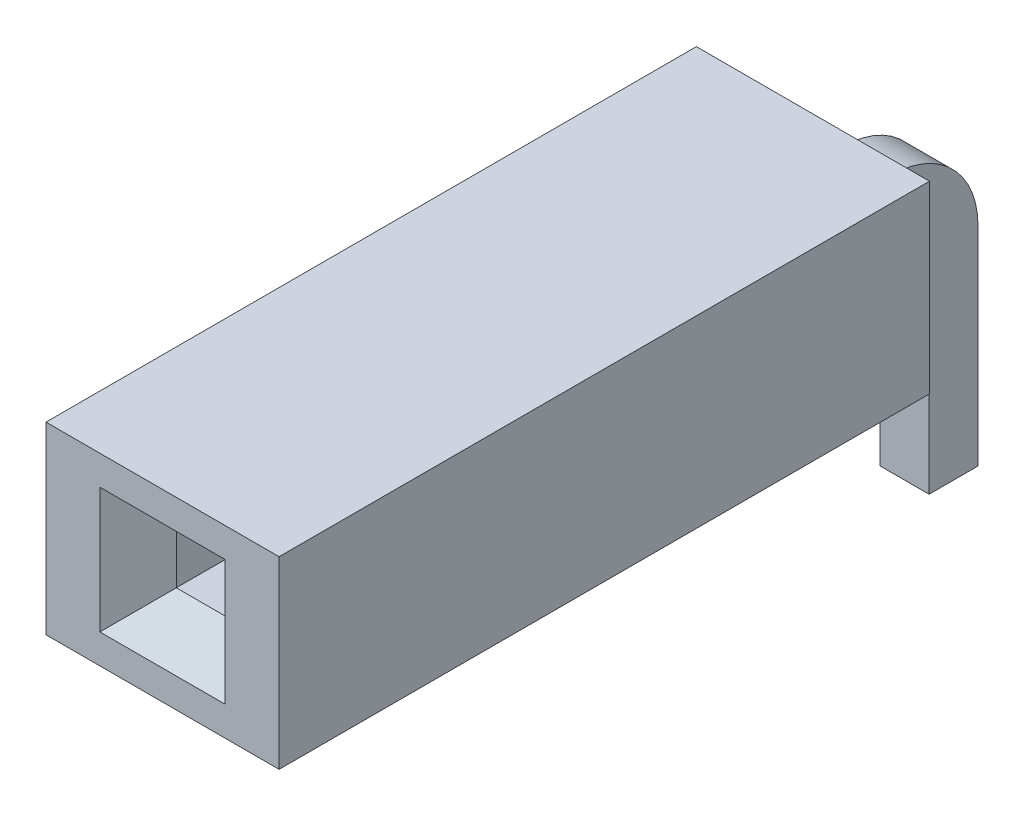
ISO-10303-21;
HEADER;
FILE_DESCRIPTION(('STEP AP214'),'2;1');
FILE_NAME('part.step','',(''),(''),'','','');
FILE_SCHEMA(('AUTOMOTIVE_DESIGN { 1 0 10303 214 1 1 1 1 }'));
ENDSEC;
DATA;
#1=APPLICATION_CONTEXT('core data for automotive mechanical design processes');
#2=APPLICATION_PROTOCOL_DEFINITION('international standard','automotive_design',2000,#1);
#3=PRODUCT_CONTEXT('',#1,'mechanical');
#4=PRODUCT('Part','Part','',(#3));
#5=PRODUCT_RELATED_PRODUCT_CATEGORY('part','',(#4));
#6=PRODUCT_DEFINITION_FORMATION('','',#4);
#7=PRODUCT_DEFINITION_CONTEXT('part definition',#1,'design');
#8=PRODUCT_DEFINITION('design','',#6,#7);
#9=PRODUCT_DEFINITION_SHAPE('','',#8);
#10=(LENGTH_UNIT() NAMED_UNIT(*) SI_UNIT(.MILLI.,.METRE.));
#11=(NAMED_UNIT(*) PLANE_ANGLE_UNIT() SI_UNIT($,.RADIAN.));
#12=(NAMED_UNIT(*) SI_UNIT($,.STERADIAN.) SOLID_ANGLE_UNIT());
#13=UNCERTAINTY_MEASURE_WITH_UNIT(LENGTH_MEASURE(1.E-05),#10,'distance_accuracy_value','');
#14=(GEOMETRIC_REPRESENTATION_CONTEXT(3) GLOBAL_UNCERTAINTY_ASSIGNED_CONTEXT((#13)) GLOBAL_UNIT_ASSIGNED_CONTEXT((#10,
#11,#12)) REPRESENTATION_CONTEXT('',''));
#15=CARTESIAN_POINT('',(0.,0.,0.));
#16=DIRECTION('',(0.,0.,1.));
#17=DIRECTION('',(1.,0.,0.));
#18=AXIS2_PLACEMENT_3D('',#15,#16,#17);
#19=CARTESIAN_POINT('',(0.,0.,0.));
#20=DIRECTION('',(0.,0.,1.));
#21=DIRECTION('',(1.,0.,0.));
#22=AXIS2_PLACEMENT_3D('',#19,#20,#21);
#23=PLANE('',#22);
#24=DIRECTION('',(0.,-1.,0.));
#25=VECTOR('',#24,1.);
#26=CARTESIAN_POINT('',(-1.525,1.205,0.));
#27=LINE('',#26,#25);
#28=CARTESIAN_POINT('',(-1.525,1.205,0.));
#29=VERTEX_POINT('',#28);
#30=CARTESIAN_POINT('',(-1.525,-1.205,0.));
#31=VERTEX_POINT('',#30);
#32=EDGE_CURVE('E269',#29,#31,#27,.T.);
#33=ORIENTED_EDGE('',*,*,#32,.F.);
#34=DIRECTION('',(1.,0.,0.));
#35=VECTOR('',#34,1.);
#36=CARTESIAN_POINT('',(-1.525,1.205,0.));
#37=LINE('',#36,#35);
#38=CARTESIAN_POINT('',(1.525,1.205,0.));
#39=VERTEX_POINT('',#38);
#40=EDGE_CURVE('E275',#29,#39,#37,.T.);
#41=ORIENTED_EDGE('',*,*,#40,.T.);
#42=DIRECTION('',(0.,-1.,0.));
#43=VECTOR('',#42,1.);
#44=CARTESIAN_POINT('',(1.525,1.205,0.));
#45=LINE('',#44,#43);
#46=CARTESIAN_POINT('',(1.525,-1.205,0.));
#47=VERTEX_POINT('',#46);
#48=EDGE_CURVE('E294',#39,#47,#45,.T.);
#49=ORIENTED_EDGE('',*,*,#48,.T.);
#50=DIRECTION('',(1.,0.,0.));
#51=VECTOR('',#50,1.);
#52=CARTESIAN_POINT('',(-1.525,-1.205,0.));
#53=LINE('',#52,#51);
#54=EDGE_CURVE('E290',#31,#47,#53,.T.);
#55=ORIENTED_EDGE('',*,*,#54,.F.);
#56=EDGE_LOOP('',(#33,#41,#49,#55));
#57=FACE_BOUND('',#56,.T.);
#58=DIRECTION('',(0.,1.,0.));
#59=VECTOR('',#58,1.);
#60=CARTESIAN_POINT('',(-0.32,-0.32,0.));
#61=LINE('',#60,#59);
#62=CARTESIAN_POINT('',(-0.32,-0.32,0.));
#63=VERTEX_POINT('',#62);
#64=CARTESIAN_POINT('',(-0.32,0.32,0.));
#65=VERTEX_POINT('',#64);
#66=EDGE_CURVE('E234',#63,#65,#61,.T.);
#67=ORIENTED_EDGE('',*,*,#66,.F.);
#68=DIRECTION('',(-1.,0.,0.));
#69=VECTOR('',#68,1.);
#70=CARTESIAN_POINT('',(0.32,-0.32,0.));
#71=LINE('',#70,#69);
#72=CARTESIAN_POINT('',(0.32,-0.32,0.));
#73=VERTEX_POINT('',#72);
#74=EDGE_CURVE('E201',#73,#63,#71,.T.);
#75=ORIENTED_EDGE('',*,*,#74,.F.);
#76=DIRECTION('',(0.,1.,0.));
#77=VECTOR('',#76,1.);
#78=CARTESIAN_POINT('',(0.32,-0.32,0.));
#79=LINE('',#78,#77);
#80=CARTESIAN_POINT('',(0.32,0.32,0.));
#81=VERTEX_POINT('',#80);
#82=EDGE_CURVE('E206',#73,#81,#79,.T.);
#83=ORIENTED_EDGE('',*,*,#82,.T.);
#84=DIRECTION('',(-1.,0.,0.));
#85=VECTOR('',#84,1.);
#86=CARTESIAN_POINT('',(0.32,0.32,0.));
#87=LINE('',#86,#85);
#88=EDGE_CURVE('E188',#81,#65,#87,.T.);
#89=ORIENTED_EDGE('',*,*,#88,.T.);
#90=EDGE_LOOP('',(#67,#75,#83,#89));
#91=FACE_BOUND('',#90,.T.);
#92=ADVANCED_FACE('F47',(#57,#91),#23,.F.);
#93=CARTESIAN_POINT('',(0.,0.,8.51));
#94=DIRECTION('',(0.,0.,1.));
#95=DIRECTION('',(1.,0.,0.));
#96=AXIS2_PLACEMENT_3D('',#93,#94,#95);
#97=PLANE('',#96);
#98=DIRECTION('',(1.,0.,0.));
#99=VECTOR('',#98,1.);
#100=CARTESIAN_POINT('',(0.32,0.82,8.51));
#101=LINE('',#100,#99);
#102=CARTESIAN_POINT('',(-0.82,0.82,8.51));
#103=VERTEX_POINT('',#102);
#104=CARTESIAN_POINT('',(0.819999999999999,0.82,8.51));
#105=VERTEX_POINT('',#104);
#106=EDGE_CURVE('E323',#103,#105,#101,.T.);
#107=ORIENTED_EDGE('',*,*,#106,.T.);
#108=DIRECTION('',(0.,-1.,0.));
#109=VECTOR('',#108,1.);
#110=CARTESIAN_POINT('',(0.82,-0.32,8.51));
#111=LINE('',#110,#109);
#112=CARTESIAN_POINT('',(0.82,-0.819999999999999,8.51));
#113=VERTEX_POINT('',#112);
#114=EDGE_CURVE('E326',#105,#113,#111,.T.);
#115=ORIENTED_EDGE('',*,*,#114,.T.);
#116=DIRECTION('',(-1.,0.,0.));
#117=VECTOR('',#116,1.);
#118=CARTESIAN_POINT('',(0.,-0.82,8.51));
#119=LINE('',#118,#117);
#120=CARTESIAN_POINT('',(-0.82,-0.82,8.51));
#121=VERTEX_POINT('',#120);
#122=EDGE_CURVE('E317',#113,#121,#119,.T.);
#123=ORIENTED_EDGE('',*,*,#122,.T.);
#124=DIRECTION('',(0.,1.,0.));
#125=VECTOR('',#124,1.);
#126=CARTESIAN_POINT('',(-0.82,0.,8.51));
#127=LINE('',#126,#125);
#128=EDGE_CURVE('E320',#121,#103,#127,.T.);
#129=ORIENTED_EDGE('',*,*,#128,.T.);
#130=EDGE_LOOP('',(#107,#115,#123,#129));
#131=FACE_BOUND('',#130,.T.);
#132=DIRECTION('',(0.,-1.,0.));
#133=VECTOR('',#132,1.);
#134=CARTESIAN_POINT('',(-1.525,1.205,8.51));
#135=LINE('',#134,#133);
#136=CARTESIAN_POINT('',(-1.525,1.205,8.51));
#137=VERTEX_POINT('',#136);
#138=CARTESIAN_POINT('',(-1.525,-1.205,8.51));
#139=VERTEX_POINT('',#138);
#140=EDGE_CURVE('E270',#137,#139,#135,.T.);
#141=ORIENTED_EDGE('',*,*,#140,.T.);
#142=DIRECTION('',(1.,0.,0.));
#143=VECTOR('',#142,1.);
#144=CARTESIAN_POINT('',(-1.525,-1.205,8.51));
#145=LINE('',#144,#143);
#146=CARTESIAN_POINT('',(1.525,-1.205,8.51));
#147=VERTEX_POINT('',#146);
#148=EDGE_CURVE('E274',#139,#147,#145,.T.);
#149=ORIENTED_EDGE('',*,*,#148,.T.);
#150=DIRECTION('',(0.,-1.,0.));
#151=VECTOR('',#150,1.);
#152=CARTESIAN_POINT('',(1.525,1.205,8.51));
#153=LINE('',#152,#151);
#154=CARTESIAN_POINT('',(1.525,1.205,8.51));
#155=VERTEX_POINT('',#154);
#156=EDGE_CURVE('E278',#155,#147,#153,.T.);
#157=ORIENTED_EDGE('',*,*,#156,.F.);
#158=DIRECTION('',(1.,0.,0.));
#159=VECTOR('',#158,1.);
#160=CARTESIAN_POINT('',(-1.525,1.205,8.51));
#161=LINE('',#160,#159);
#162=EDGE_CURVE('E282',#137,#155,#161,.T.);
#163=ORIENTED_EDGE('',*,*,#162,.F.);
#164=EDGE_LOOP('',(#141,#149,#157,#163));
#165=FACE_BOUND('',#164,.T.);
#166=ADVANCED_FACE('F441',(#131,#165),#97,.T.);
#167=CARTESIAN_POINT('',(-1.525,1.205,8.51));
#168=DIRECTION('',(1.,0.,0.));
#169=DIRECTION('',(0.,0.,-1.));
#170=AXIS2_PLACEMENT_3D('',#167,#168,#169);
#171=PLANE('',#170);
#172=ORIENTED_EDGE('',*,*,#32,.T.);
#173=DIRECTION('',(0.,0.,-1.));
#174=VECTOR('',#173,1.);
#175=CARTESIAN_POINT('',(-1.525,-1.205,8.51));
#176=LINE('',#175,#174);
#177=EDGE_CURVE('E309',#139,#31,#176,.T.);
#178=ORIENTED_EDGE('',*,*,#177,.F.);
#179=ORIENTED_EDGE('',*,*,#140,.F.);
#180=DIRECTION('',(0.,0.,-1.));
#181=VECTOR('',#180,1.);
#182=CARTESIAN_POINT('',(-1.525,1.205,8.51));
#183=LINE('',#182,#181);
#184=EDGE_CURVE('E286',#137,#29,#183,.T.);
#185=ORIENTED_EDGE('',*,*,#184,.T.);
#186=EDGE_LOOP('',(#172,#178,#179,#185));
#187=FACE_BOUND('',#186,.T.);
#188=ADVANCED_FACE('F446',(#187),#171,.F.);
#189=CARTESIAN_POINT('',(-1.525,-1.205,8.51));
#190=DIRECTION('',(0.,1.,0.));
#191=DIRECTION('',(0.,0.,1.));
#192=AXIS2_PLACEMENT_3D('',#189,#190,#191);
#193=PLANE('',#192);
#194=ORIENTED_EDGE('',*,*,#54,.T.);
#195=DIRECTION('',(0.,0.,-1.));
#196=VECTOR('',#195,1.);
#197=CARTESIAN_POINT('',(1.525,-1.205,8.51));
#198=LINE('',#197,#196);
#199=EDGE_CURVE('E306',#147,#47,#198,.T.);
#200=ORIENTED_EDGE('',*,*,#199,.F.);
#201=ORIENTED_EDGE('',*,*,#148,.F.);
#202=ORIENTED_EDGE('',*,*,#177,.T.);
#203=EDGE_LOOP('',(#194,#200,#201,#202));
#204=FACE_BOUND('',#203,.T.);
#205=ADVANCED_FACE('F460',(#204),#193,.F.);
#206=CARTESIAN_POINT('',(1.525,1.205,8.51));
#207=DIRECTION('',(1.,0.,0.));
#208=DIRECTION('',(0.,0.,-1.));
#209=AXIS2_PLACEMENT_3D('',#206,#207,#208);
#210=PLANE('',#209);
#211=ORIENTED_EDGE('',*,*,#48,.F.);
#212=DIRECTION('',(0.,0.,-1.));
#213=VECTOR('',#212,1.);
#214=CARTESIAN_POINT('',(1.525,1.205,8.51));
#215=LINE('',#214,#213);
#216=EDGE_CURVE('E303',#155,#39,#215,.T.);
#217=ORIENTED_EDGE('',*,*,#216,.F.);
#218=ORIENTED_EDGE('',*,*,#156,.T.);
#219=ORIENTED_EDGE('',*,*,#199,.T.);
#220=EDGE_LOOP('',(#211,#217,#218,#219));
#221=FACE_BOUND('',#220,.T.);
#222=ADVANCED_FACE('F456',(#221),#210,.T.);
#223=CARTESIAN_POINT('',(-1.525,1.205,8.51));
#224=DIRECTION('',(0.,1.,0.));
#225=DIRECTION('',(0.,0.,1.));
#226=AXIS2_PLACEMENT_3D('',#223,#224,#225);
#227=PLANE('',#226);
#228=ORIENTED_EDGE('',*,*,#40,.F.);
#229=ORIENTED_EDGE('',*,*,#184,.F.);
#230=ORIENTED_EDGE('',*,*,#162,.T.);
#231=ORIENTED_EDGE('',*,*,#216,.T.);
#232=EDGE_LOOP('',(#228,#229,#230,#231));
#233=FACE_BOUND('',#232,.T.);
#234=ADVANCED_FACE('F452',(#233),#227,.T.);
#235=CARTESIAN_POINT('',(-0.32,0.,3.51));
#236=DIRECTION('',(1.,0.,0.));
#237=DIRECTION('',(0.,0.,-1.));
#238=AXIS2_PLACEMENT_3D('',#235,#236,#237);
#239=PLANE('',#238);
#240=DIRECTION('',(0.,0.,1.));
#241=VECTOR('',#240,1.);
#242=CARTESIAN_POINT('',(-0.32,0.32,3.51));
#243=LINE('',#242,#241);
#244=CARTESIAN_POINT('',(-0.32,0.32,3.51));
#245=VERTEX_POINT('',#244);
#246=CARTESIAN_POINT('',(-0.32,0.32,8.01));
#247=VERTEX_POINT('',#246);
#248=EDGE_CURVE('E265',#245,#247,#243,.T.);
#249=ORIENTED_EDGE('',*,*,#248,.T.);
#250=DIRECTION('',(0.,-1.,0.));
#251=VECTOR('',#250,1.);
#252=CARTESIAN_POINT('',(-0.32,0.,8.01));
#253=LINE('',#252,#251);
#254=CARTESIAN_POINT('',(-0.32,-0.32,8.01));
#255=VERTEX_POINT('',#254);
#256=EDGE_CURVE('E333',#247,#255,#253,.T.);
#257=ORIENTED_EDGE('',*,*,#256,.T.);
#258=DIRECTION('',(0.,0.,1.));
#259=VECTOR('',#258,1.);
#260=CARTESIAN_POINT('',(-0.32,-0.32,3.51));
#261=LINE('',#260,#259);
#262=CARTESIAN_POINT('',(-0.32,-0.32,3.51));
#263=VERTEX_POINT('',#262);
#264=EDGE_CURVE('E253',#263,#255,#261,.T.);
#265=ORIENTED_EDGE('',*,*,#264,.F.);
#266=DIRECTION('',(0.,1.,0.));
#267=VECTOR('',#266,1.);
#268=CARTESIAN_POINT('',(-0.32,0.,3.51));
#269=LINE('',#268,#267);
#270=EDGE_CURVE('E238',#263,#245,#269,.T.);
#271=ORIENTED_EDGE('',*,*,#270,.T.);
#272=EDGE_LOOP('',(#249,#257,#265,#271));
#273=FACE_BOUND('',#272,.T.);
#274=ADVANCED_FACE('F455',(#273),#239,.T.);
#275=CARTESIAN_POINT('',(0.,0.32,3.51));
#276=DIRECTION('',(0.,1.,0.));
#277=DIRECTION('',(0.,0.,1.));
#278=AXIS2_PLACEMENT_3D('',#275,#276,#277);
#279=PLANE('',#278);
#280=DIRECTION('',(0.,0.,1.));
#281=VECTOR('',#280,1.);
#282=CARTESIAN_POINT('',(0.32,0.32,3.51));
#283=LINE('',#282,#281);
#284=CARTESIAN_POINT('',(0.32,0.32,3.51));
#285=VERTEX_POINT('',#284);
#286=CARTESIAN_POINT('',(0.32,0.32,8.01));
#287=VERTEX_POINT('',#286);
#288=EDGE_CURVE('E261',#285,#287,#283,.T.);
#289=ORIENTED_EDGE('',*,*,#288,.T.);
#290=DIRECTION('',(-1.,0.,0.));
#291=VECTOR('',#290,1.);
#292=CARTESIAN_POINT('',(-0.32,0.32,8.01));
#293=LINE('',#292,#291);
#294=EDGE_CURVE('E330',#287,#247,#293,.T.);
#295=ORIENTED_EDGE('',*,*,#294,.T.);
#296=ORIENTED_EDGE('',*,*,#248,.F.);
#297=DIRECTION('',(-1.,0.,0.));
#298=VECTOR('',#297,1.);
#299=CARTESIAN_POINT('',(0.,0.32,3.51));
#300=LINE('',#299,#298);
#301=EDGE_CURVE('E241',#285,#245,#300,.T.);
#302=ORIENTED_EDGE('',*,*,#301,.F.);
#303=EDGE_LOOP('',(#289,#295,#296,#302));
#304=FACE_BOUND('',#303,.T.);
#305=ADVANCED_FACE('F574',(#304),#279,.F.);
#306=CARTESIAN_POINT('',(0.32,0.,3.51));
#307=DIRECTION('',(1.,0.,0.));
#308=DIRECTION('',(0.,1.,0.));
#309=AXIS2_PLACEMENT_3D('',#306,#307,#308);
#310=PLANE('',#309);
#311=DIRECTION('',(0.,0.,1.));
#312=VECTOR('',#311,1.);
#313=CARTESIAN_POINT('',(0.32,-0.32,3.51));
#314=LINE('',#313,#312);
#315=CARTESIAN_POINT('',(0.32,-0.32,3.51));
#316=VERTEX_POINT('',#315);
#317=CARTESIAN_POINT('',(0.32,-0.32,8.01));
#318=VERTEX_POINT('',#317);
#319=EDGE_CURVE('E257',#316,#318,#314,.T.);
#320=ORIENTED_EDGE('',*,*,#319,.T.);
#321=DIRECTION('',(0.,1.,0.));
#322=VECTOR('',#321,1.);
#323=CARTESIAN_POINT('',(0.32,0.32,8.01));
#324=LINE('',#323,#322);
#325=EDGE_CURVE('E313',#318,#287,#324,.T.);
#326=ORIENTED_EDGE('',*,*,#325,.T.);
#327=ORIENTED_EDGE('',*,*,#288,.F.);
#328=DIRECTION('',(0.,1.,0.));
#329=VECTOR('',#328,1.);
#330=CARTESIAN_POINT('',(0.32,0.,3.51));
#331=LINE('',#330,#329);
#332=EDGE_CURVE('E246',#316,#285,#331,.T.);
#333=ORIENTED_EDGE('',*,*,#332,.F.);
#334=EDGE_LOOP('',(#320,#326,#327,#333));
#335=FACE_BOUND('',#334,.T.);
#336=ADVANCED_FACE('F567',(#335),#310,.F.);
#337=CARTESIAN_POINT('',(0.,-0.32,3.51));
#338=DIRECTION('',(0.,1.,0.));
#339=DIRECTION('',(-1.,0.,0.));
#340=AXIS2_PLACEMENT_3D('',#337,#338,#339);
#341=PLANE('',#340);
#342=ORIENTED_EDGE('',*,*,#264,.T.);
#343=DIRECTION('',(1.,0.,0.));
#344=VECTOR('',#343,1.);
#345=CARTESIAN_POINT('',(0.,-0.32,8.01));
#346=LINE('',#345,#344);
#347=EDGE_CURVE('E336',#255,#318,#346,.T.);
#348=ORIENTED_EDGE('',*,*,#347,.T.);
#349=ORIENTED_EDGE('',*,*,#319,.F.);
#350=DIRECTION('',(-1.,0.,0.));
#351=VECTOR('',#350,1.);
#352=CARTESIAN_POINT('',(0.,-0.32,3.51));
#353=LINE('',#352,#351);
#354=EDGE_CURVE('E250',#316,#263,#353,.T.);
#355=ORIENTED_EDGE('',*,*,#354,.T.);
#356=EDGE_LOOP('',(#342,#348,#349,#355));
#357=FACE_BOUND('',#356,.T.);
#358=ADVANCED_FACE('F559',(#357),#341,.T.);
#359=CARTESIAN_POINT('',(0.,0.,3.51));
#360=DIRECTION('',(0.,0.,1.));
#361=DIRECTION('',(1.,0.,0.));
#362=AXIS2_PLACEMENT_3D('',#359,#360,#361);
#363=PLANE('',#362);
#364=ORIENTED_EDGE('',*,*,#270,.F.);
#365=ORIENTED_EDGE('',*,*,#354,.F.);
#366=ORIENTED_EDGE('',*,*,#332,.T.);
#367=ORIENTED_EDGE('',*,*,#301,.T.);
#368=EDGE_LOOP('',(#364,#365,#366,#367));
#369=FACE_BOUND('',#368,.T.);
#370=ADVANCED_FACE('F483',(#369),#363,.T.);
#371=CARTESIAN_POINT('',(-0.82,0.,8.51));
#372=DIRECTION('',(-0.707106781186549,0.,-0.707106781186546));
#373=DIRECTION('',(0.,1.,0.));
#374=AXIS2_PLACEMENT_3D('',#371,#372,#373);
#375=PLANE('',#374);
#376=DIRECTION('',(0.577350269189625,-0.577350269189625,-0.577350269189628));
#377=VECTOR('',#376,1.);
#378=CARTESIAN_POINT('',(-0.213333333333334,0.213333333333334,7.90333333333333));
#379=LINE('',#378,#377);
#380=EDGE_CURVE('E344',#103,#247,#379,.T.);
#381=ORIENTED_EDGE('',*,*,#380,.F.);
#382=ORIENTED_EDGE('',*,*,#128,.F.);
#383=DIRECTION('',(-0.577350269189625,-0.577350269189625,0.577350269189628));
#384=VECTOR('',#383,1.);
#385=CARTESIAN_POINT('',(-0.546666666666667,-0.546666666666667,8.23666666666667));
#386=LINE('',#385,#384);
#387=EDGE_CURVE('E242',#255,#121,#386,.T.);
#388=ORIENTED_EDGE('',*,*,#387,.F.);
#389=ORIENTED_EDGE('',*,*,#256,.F.);
#390=EDGE_LOOP('',(#381,#382,#388,#389));
#391=FACE_BOUND('',#390,.T.);
#392=ADVANCED_FACE('F479',(#391),#375,.F.);
#393=CARTESIAN_POINT('',(0.,-0.82,8.51));
#394=DIRECTION('',(0.,-0.707106781186549,-0.707106781186546));
#395=DIRECTION('',(-1.,0.,0.));
#396=AXIS2_PLACEMENT_3D('',#393,#394,#395);
#397=PLANE('',#396);
#398=ORIENTED_EDGE('',*,*,#387,.T.);
#399=ORIENTED_EDGE('',*,*,#122,.F.);
#400=DIRECTION('',(0.577350269189625,-0.577350269189625,0.577350269189628));
#401=VECTOR('',#400,1.);
#402=CARTESIAN_POINT('',(0.213333333333334,-0.213333333333334,7.90333333333333));
#403=LINE('',#402,#401);
#404=EDGE_CURVE('E342',#318,#113,#403,.T.);
#405=ORIENTED_EDGE('',*,*,#404,.F.);
#406=ORIENTED_EDGE('',*,*,#347,.F.);
#407=EDGE_LOOP('',(#398,#399,#405,#406));
#408=FACE_BOUND('',#407,.T.);
#409=ADVANCED_FACE('F475',(#408),#397,.F.);
#410=CARTESIAN_POINT('',(0.,0.32,8.01));
#411=DIRECTION('',(0.,-0.707106781186549,0.707106781186546));
#412=DIRECTION('',(1.,0.,0.));
#413=AXIS2_PLACEMENT_3D('',#410,#411,#412);
#414=PLANE('',#413);
#415=ORIENTED_EDGE('',*,*,#380,.T.);
#416=ORIENTED_EDGE('',*,*,#294,.F.);
#417=DIRECTION('',(0.577350269189625,0.577350269189625,0.577350269189628));
#418=VECTOR('',#417,1.);
#419=CARTESIAN_POINT('',(0.213333333333334,0.213333333333334,7.90333333333333));
#420=LINE('',#419,#418);
#421=EDGE_CURVE('E200',#105,#287,#420,.F.);
#422=ORIENTED_EDGE('',*,*,#421,.F.);
#423=ORIENTED_EDGE('',*,*,#106,.F.);
#424=EDGE_LOOP('',(#415,#416,#422,#423));
#425=FACE_BOUND('',#424,.T.);
#426=ADVANCED_FACE('F471',(#425),#414,.T.);
#427=CARTESIAN_POINT('',(0.32,0.,8.01));
#428=DIRECTION('',(-0.707106781186549,0.,0.707106781186546));
#429=DIRECTION('',(0.,-1.,0.));
#430=AXIS2_PLACEMENT_3D('',#427,#428,#429);
#431=PLANE('',#430);
#432=ORIENTED_EDGE('',*,*,#404,.T.);
#433=ORIENTED_EDGE('',*,*,#114,.F.);
#434=ORIENTED_EDGE('',*,*,#421,.T.);
#435=ORIENTED_EDGE('',*,*,#325,.F.);
#436=EDGE_LOOP('',(#432,#433,#434,#435));
#437=FACE_BOUND('',#436,.T.);
#438=ADVANCED_FACE('F468',(#437),#431,.T.);
#439=CARTESIAN_POINT('',(0.32,-0.32,0.));
#440=DIRECTION('',(0.,1.,0.));
#441=DIRECTION('',(0.,0.,1.));
#442=AXIS2_PLACEMENT_3D('',#439,#440,#441);
#443=PLANE('',#442);
#444=DIRECTION('',(0.,0.,-1.));
#445=VECTOR('',#444,1.);
#446=CARTESIAN_POINT('',(-0.32,-0.32,0.));
#447=LINE('',#446,#445);
#448=CARTESIAN_POINT('',(-0.32,-0.32,-0.7));
#449=VERTEX_POINT('',#448);
#450=EDGE_CURVE('E221',#63,#449,#447,.T.);
#451=ORIENTED_EDGE('',*,*,#450,.T.);
#452=DIRECTION('',(-1.,0.,0.));
#453=VECTOR('',#452,1.);
#454=CARTESIAN_POINT('',(0.32,-0.32,-0.7));
#455=LINE('',#454,#453);
#456=CARTESIAN_POINT('',(0.32,-0.32,-0.7));
#457=VERTEX_POINT('',#456);
#458=EDGE_CURVE('E365',#449,#457,#455,.F.);
#459=ORIENTED_EDGE('',*,*,#458,.T.);
#460=DIRECTION('',(0.,0.,-1.));
#461=VECTOR('',#460,1.);
#462=CARTESIAN_POINT('',(0.32,-0.32,0.));
#463=LINE('',#462,#461);
#464=EDGE_CURVE('E236',#73,#457,#463,.T.);
#465=ORIENTED_EDGE('',*,*,#464,.F.);
#466=ORIENTED_EDGE('',*,*,#74,.T.);
#467=EDGE_LOOP('',(#451,#459,#465,#466));
#468=FACE_BOUND('',#467,.T.);
#469=ADVANCED_FACE('F438',(#468),#443,.F.);
#470=CARTESIAN_POINT('',(0.32,-0.32,-1.2));
#471=DIRECTION('',(0.,0.,-1.));
#472=DIRECTION('',(0.,1.,0.));
#473=AXIS2_PLACEMENT_3D('',#470,#471,#472);
#474=PLANE('',#473);
#475=DIRECTION('',(0.,-1.,0.));
#476=VECTOR('',#475,1.);
#477=CARTESIAN_POINT('',(-0.32,-0.32,-1.2));
#478=LINE('',#477,#476);
#479=CARTESIAN_POINT('',(-0.32,-0.82,-1.2));
#480=VERTEX_POINT('',#479);
#481=CARTESIAN_POINT('',(-0.32,-3.545,-1.2));
#482=VERTEX_POINT('',#481);
#483=EDGE_CURVE('E225',#480,#482,#478,.T.);
#484=ORIENTED_EDGE('',*,*,#483,.T.);
#485=DIRECTION('',(1.,0.,0.));
#486=VECTOR('',#485,1.);
#487=CARTESIAN_POINT('',(0.32,-3.545,-1.2));
#488=LINE('',#487,#486);
#489=CARTESIAN_POINT('',(0.32,-3.545,-1.2));
#490=VERTEX_POINT('',#489);
#491=EDGE_CURVE('E12',#482,#490,#488,.T.);
#492=ORIENTED_EDGE('',*,*,#491,.T.);
#493=DIRECTION('',(0.,-1.,0.));
#494=VECTOR('',#493,1.);
#495=CARTESIAN_POINT('',(0.32,-0.32,-1.2));
#496=LINE('',#495,#494);
#497=CARTESIAN_POINT('',(0.32,-0.82,-1.2));
#498=VERTEX_POINT('',#497);
#499=EDGE_CURVE('E666',#498,#490,#496,.T.);
#500=ORIENTED_EDGE('',*,*,#499,.F.);
#501=DIRECTION('',(-1.,0.,0.));
#502=VECTOR('',#501,1.);
#503=CARTESIAN_POINT('',(-0.32,-0.82,-1.2));
#504=LINE('',#503,#502);
#505=EDGE_CURVE('E361',#498,#480,#504,.T.);
#506=ORIENTED_EDGE('',*,*,#505,.T.);
#507=EDGE_LOOP('',(#484,#492,#500,#506));
#508=FACE_BOUND('',#507,.T.);
#509=ADVANCED_FACE('F432',(#508),#474,.F.);
#510=CARTESIAN_POINT('',(0.32,-3.745,-1.2));
#511=DIRECTION('',(0.,1.,0.));
#512=DIRECTION('',(0.,0.,1.));
#513=AXIS2_PLACEMENT_3D('',#510,#511,#512);
#514=PLANE('',#513);
#515=DIRECTION('',(-1.,0.,0.));
#516=VECTOR('',#515,1.);
#517=CARTESIAN_POINT('',(0.32,-3.745,-1.4));
#518=LINE('',#517,#516);
#519=CARTESIAN_POINT('',(0.120000000000001,-3.745,-1.4));
#520=VERTEX_POINT('',#519);
#521=CARTESIAN_POINT('',(-0.120000000000001,-3.745,-1.4));
#522=VERTEX_POINT('',#521);
#523=EDGE_CURVE('E374',#520,#522,#518,.T.);
#524=ORIENTED_EDGE('',*,*,#523,.T.);
#525=DIRECTION('',(0.,0.,-1.));
#526=VECTOR('',#525,1.);
#527=CARTESIAN_POINT('',(-0.120000000000001,-3.745,-1.84));
#528=LINE('',#527,#526);
#529=CARTESIAN_POINT('',(-0.120000000000001,-3.745,-1.64));
#530=VERTEX_POINT('',#529);
#531=EDGE_CURVE('E383',#522,#530,#528,.T.);
#532=ORIENTED_EDGE('',*,*,#531,.T.);
#533=DIRECTION('',(1.,0.,0.));
#534=VECTOR('',#533,1.);
#535=CARTESIAN_POINT('',(0.32,-3.745,-1.64));
#536=LINE('',#535,#534);
#537=CARTESIAN_POINT('',(0.120000000000001,-3.745,-1.64));
#538=VERTEX_POINT('',#537);
#539=EDGE_CURVE('E380',#530,#538,#536,.T.);
#540=ORIENTED_EDGE('',*,*,#539,.T.);
#541=DIRECTION('',(0.,0.,1.));
#542=VECTOR('',#541,1.);
#543=CARTESIAN_POINT('',(0.120000000000001,-3.745,-1.2));
#544=LINE('',#543,#542);
#545=EDGE_CURVE('E377',#538,#520,#544,.T.);
#546=ORIENTED_EDGE('',*,*,#545,.T.);
#547=EDGE_LOOP('',(#524,#532,#540,#546));
#548=FACE_BOUND('',#547,.T.);
#549=ADVANCED_FACE('F430',(#548),#514,.F.);
#550=CARTESIAN_POINT('',(0.32,0.32,-1.84));
#551=DIRECTION('',(0.,0.,-1.));
#552=DIRECTION('',(0.,1.,0.));
#553=AXIS2_PLACEMENT_3D('',#550,#551,#552);
#554=PLANE('',#553);
#555=DIRECTION('',(0.,-1.,0.));
#556=VECTOR('',#555,1.);
#557=CARTESIAN_POINT('',(0.32,0.32,-1.84));
#558=LINE('',#557,#556);
#559=CARTESIAN_POINT('',(0.32,-0.82,-1.84));
#560=VERTEX_POINT('',#559);
#561=CARTESIAN_POINT('',(0.32,-3.545,-1.84));
#562=VERTEX_POINT('',#561);
#563=EDGE_CURVE('E211',#560,#562,#558,.T.);
#564=ORIENTED_EDGE('',*,*,#563,.T.);
#565=DIRECTION('',(-1.,0.,0.));
#566=VECTOR('',#565,1.);
#567=CARTESIAN_POINT('',(-0.32,-3.545,-1.84));
#568=LINE('',#567,#566);
#569=CARTESIAN_POINT('',(-0.32,-3.545,-1.84));
#570=VERTEX_POINT('',#569);
#571=EDGE_CURVE('E391',#562,#570,#568,.T.);
#572=ORIENTED_EDGE('',*,*,#571,.T.);
#573=DIRECTION('',(0.,-1.,0.));
#574=VECTOR('',#573,1.);
#575=CARTESIAN_POINT('',(-0.32,0.32,-1.84));
#576=LINE('',#575,#574);
#577=CARTESIAN_POINT('',(-0.32,-0.82,-1.84));
#578=VERTEX_POINT('',#577);
#579=EDGE_CURVE('E228',#578,#570,#576,.T.);
#580=ORIENTED_EDGE('',*,*,#579,.F.);
#581=DIRECTION('',(-1.,0.,0.));
#582=VECTOR('',#581,1.);
#583=CARTESIAN_POINT('',(0.32,-0.82,-1.84));
#584=LINE('',#583,#582);
#585=EDGE_CURVE('E356',#578,#560,#584,.F.);
#586=ORIENTED_EDGE('',*,*,#585,.T.);
#587=EDGE_LOOP('',(#564,#572,#580,#586));
#588=FACE_BOUND('',#587,.T.);
#589=ADVANCED_FACE('F420',(#588),#554,.T.);
#590=CARTESIAN_POINT('',(0.32,0.32,0.));
#591=DIRECTION('',(0.,1.,0.));
#592=DIRECTION('',(0.,0.,1.));
#593=AXIS2_PLACEMENT_3D('',#590,#591,#592);
#594=PLANE('',#593);
#595=DIRECTION('',(0.,0.,-1.));
#596=VECTOR('',#595,1.);
#597=CARTESIAN_POINT('',(0.32,0.32,0.));
#598=LINE('',#597,#596);
#599=CARTESIAN_POINT('',(0.32,0.32,-0.7));
#600=VERTEX_POINT('',#599);
#601=EDGE_CURVE('E192',#81,#600,#598,.T.);
#602=ORIENTED_EDGE('',*,*,#601,.T.);
#603=DIRECTION('',(-1.,0.,0.));
#604=VECTOR('',#603,1.);
#605=CARTESIAN_POINT('',(0.32,0.32,-0.7));
#606=LINE('',#605,#604);
#607=CARTESIAN_POINT('',(-0.32,0.32,-0.7));
#608=VERTEX_POINT('',#607);
#609=EDGE_CURVE('E339',#600,#608,#606,.T.);
#610=ORIENTED_EDGE('',*,*,#609,.T.);
#611=DIRECTION('',(0.,0.,-1.));
#612=VECTOR('',#611,1.);
#613=CARTESIAN_POINT('',(-0.32,0.32,0.));
#614=LINE('',#613,#612);
#615=EDGE_CURVE('E195',#65,#608,#614,.T.);
#616=ORIENTED_EDGE('',*,*,#615,.F.);
#617=ORIENTED_EDGE('',*,*,#88,.F.);
#618=EDGE_LOOP('',(#602,#610,#616,#617));
#619=FACE_BOUND('',#618,.T.);
#620=ADVANCED_FACE('F190',(#619),#594,.T.);
#621=CARTESIAN_POINT('',(0.32,0.,0.));
#622=DIRECTION('',(-1.,0.,0.));
#623=DIRECTION('',(0.,0.,1.));
#624=AXIS2_PLACEMENT_3D('',#621,#622,#623);
#625=PLANE('',#624);
#626=ORIENTED_EDGE('',*,*,#499,.T.);
#627=DIRECTION('',(0.,0.,-1.));
#628=VECTOR('',#627,1.);
#629=CARTESIAN_POINT('',(0.32,-3.545,0.));
#630=LINE('',#629,#628);
#631=EDGE_CURVE('E57',#490,#562,#630,.T.);
#632=ORIENTED_EDGE('',*,*,#631,.T.);
#633=ORIENTED_EDGE('',*,*,#563,.F.);
#634=CARTESIAN_POINT('',(0.32,-0.82,-0.7));
#635=DIRECTION('',(-1.,0.,0.));
#636=DIRECTION('',(0.,0.,1.));
#637=AXIS2_PLACEMENT_3D('',#634,#635,#636);
#638=CIRCLE('',#637,1.14);
#639=EDGE_CURVE('E209',#560,#600,#638,.F.);
#640=ORIENTED_EDGE('',*,*,#639,.T.);
#641=ORIENTED_EDGE('',*,*,#601,.F.);
#642=ORIENTED_EDGE('',*,*,#82,.F.);
#643=ORIENTED_EDGE('',*,*,#464,.T.);
#644=CARTESIAN_POINT('',(0.32,-0.82,-0.7));
#645=DIRECTION('',(-1.,0.,0.));
#646=DIRECTION('',(0.,0.,1.));
#647=AXIS2_PLACEMENT_3D('',#644,#645,#646);
#648=CIRCLE('',#647,0.5);
#649=EDGE_CURVE('E371',#457,#498,#648,.T.);
#650=ORIENTED_EDGE('',*,*,#649,.T.);
#651=EDGE_LOOP('',(#626,#632,#633,#640,#641,#642,#643,#650));
#652=FACE_BOUND('',#651,.T.);
#653=ADVANCED_FACE('F204',(#652),#625,.F.);
#654=CARTESIAN_POINT('',(-0.32,0.,0.));
#655=DIRECTION('',(-1.,0.,0.));
#656=DIRECTION('',(0.,0.,1.));
#657=AXIS2_PLACEMENT_3D('',#654,#655,#656);
#658=PLANE('',#657);
#659=ORIENTED_EDGE('',*,*,#579,.T.);
#660=DIRECTION('',(0.,0.,1.));
#661=VECTOR('',#660,1.);
#662=CARTESIAN_POINT('',(-0.32,-3.545,-1.2));
#663=LINE('',#662,#661);
#664=EDGE_CURVE('E387',#570,#482,#663,.T.);
#665=ORIENTED_EDGE('',*,*,#664,.T.);
#666=ORIENTED_EDGE('',*,*,#483,.F.);
#667=CARTESIAN_POINT('',(-0.32,-0.82,-0.7));
#668=DIRECTION('',(-1.,0.,0.));
#669=DIRECTION('',(0.,0.,1.));
#670=AXIS2_PLACEMENT_3D('',#667,#668,#669);
#671=CIRCLE('',#670,0.5);
#672=EDGE_CURVE('E368',#480,#449,#671,.F.);
#673=ORIENTED_EDGE('',*,*,#672,.T.);
#674=ORIENTED_EDGE('',*,*,#450,.F.);
#675=ORIENTED_EDGE('',*,*,#66,.T.);
#676=ORIENTED_EDGE('',*,*,#615,.T.);
#677=CARTESIAN_POINT('',(-0.32,-0.82,-0.7));
#678=DIRECTION('',(-1.,0.,0.));
#679=DIRECTION('',(0.,0.,1.));
#680=AXIS2_PLACEMENT_3D('',#677,#678,#679);
#681=CIRCLE('',#680,1.14);
#682=EDGE_CURVE('E353',#608,#578,#681,.T.);
#683=ORIENTED_EDGE('',*,*,#682,.T.);
#684=EDGE_LOOP('',(#659,#665,#666,#673,#674,#675,#676,#683));
#685=FACE_BOUND('',#684,.T.);
#686=ADVANCED_FACE('F424',(#685),#658,.T.);
#687=CARTESIAN_POINT('',(0.32,-0.82,-0.7));
#688=DIRECTION('',(-1.,0.,0.));
#689=DIRECTION('',(0.,0.,1.));
#690=AXIS2_PLACEMENT_3D('',#687,#688,#689);
#691=CYLINDRICAL_SURFACE('',#690,1.14);
#692=ORIENTED_EDGE('',*,*,#639,.F.);
#693=ORIENTED_EDGE('',*,*,#585,.F.);
#694=ORIENTED_EDGE('',*,*,#682,.F.);
#695=ORIENTED_EDGE('',*,*,#609,.F.);
#696=EDGE_LOOP('',(#692,#693,#694,#695));
#697=FACE_BOUND('',#696,.T.);
#698=ADVANCED_FACE('F485',(#697),#691,.T.);
#699=CARTESIAN_POINT('',(0.32,-0.82,-0.7));
#700=DIRECTION('',(1.,0.,0.));
#701=DIRECTION('',(0.,0.,-1.));
#702=AXIS2_PLACEMENT_3D('',#699,#700,#701);
#703=CYLINDRICAL_SURFACE('',#702,0.5);
#704=ORIENTED_EDGE('',*,*,#649,.F.);
#705=ORIENTED_EDGE('',*,*,#458,.F.);
#706=ORIENTED_EDGE('',*,*,#672,.F.);
#707=ORIENTED_EDGE('',*,*,#505,.F.);
#708=EDGE_LOOP('',(#704,#705,#706,#707));
#709=FACE_BOUND('',#708,.T.);
#710=ADVANCED_FACE('F488',(#709),#703,.F.);
#711=CARTESIAN_POINT('',(0.32,-3.545,0.));
#712=DIRECTION('',(-0.707106781186551,0.707106781186544,0.));
#713=DIRECTION('',(0.,0.,-1.));
#714=AXIS2_PLACEMENT_3D('',#711,#712,#713);
#715=PLANE('',#714);
#716=DIRECTION('',(-0.577350269189624,-0.577350269189629,0.577350269189624));
#717=VECTOR('',#716,1.);
#718=CARTESIAN_POINT('',(-0.29333333333333,-4.15833333333333,-1.22666666666667));
#719=LINE('',#718,#717);
#720=EDGE_CURVE('E401',#562,#538,#719,.T.);
#721=ORIENTED_EDGE('',*,*,#720,.F.);
#722=ORIENTED_EDGE('',*,*,#631,.F.);
#723=DIRECTION('',(0.577350269189624,0.577350269189629,0.577350269189624));
#724=VECTOR('',#723,1.);
#725=CARTESIAN_POINT('',(0.186666666666667,-3.67833333333333,-1.33333333333333));
#726=LINE('',#725,#724);
#727=EDGE_CURVE('E51',#520,#490,#726,.T.);
#728=ORIENTED_EDGE('',*,*,#727,.F.);
#729=ORIENTED_EDGE('',*,*,#545,.F.);
#730=EDGE_LOOP('',(#721,#722,#728,#729));
#731=FACE_BOUND('',#730,.T.);
#732=ADVANCED_FACE('F49',(#731),#715,.F.);
#733=CARTESIAN_POINT('',(0.32,-3.745,-1.4));
#734=DIRECTION('',(0.,0.707106781186544,-0.707106781186551));
#735=DIRECTION('',(-1.,0.,0.));
#736=AXIS2_PLACEMENT_3D('',#733,#734,#735);
#737=PLANE('',#736);
#738=ORIENTED_EDGE('',*,*,#727,.T.);
#739=ORIENTED_EDGE('',*,*,#491,.F.);
#740=DIRECTION('',(-0.577350269189624,0.577350269189629,0.577350269189624));
#741=VECTOR('',#740,1.);
#742=CARTESIAN_POINT('',(0.026666666666665,-3.89166666666667,-1.54666666666667));
#743=LINE('',#742,#741);
#744=EDGE_CURVE('E399',#522,#482,#743,.T.);
#745=ORIENTED_EDGE('',*,*,#744,.F.);
#746=ORIENTED_EDGE('',*,*,#523,.F.);
#747=EDGE_LOOP('',(#738,#739,#745,#746));
#748=FACE_BOUND('',#747,.T.);
#749=ADVANCED_FACE('F412',(#748),#737,.F.);
#750=CARTESIAN_POINT('',(0.32,-3.545,-1.84));
#751=DIRECTION('',(0.,-0.707106781186544,-0.707106781186551));
#752=DIRECTION('',(1.,0.,0.));
#753=AXIS2_PLACEMENT_3D('',#750,#751,#752);
#754=PLANE('',#753);
#755=ORIENTED_EDGE('',*,*,#720,.T.);
#756=ORIENTED_EDGE('',*,*,#539,.F.);
#757=DIRECTION('',(-0.577350269189624,0.577350269189629,-0.577350269189624));
#758=VECTOR('',#757,1.);
#759=CARTESIAN_POINT('',(-0.106666666666668,-3.75833333333333,-1.62666666666667));
#760=LINE('',#759,#758);
#761=EDGE_CURVE('E396',#570,#530,#760,.F.);
#762=ORIENTED_EDGE('',*,*,#761,.F.);
#763=ORIENTED_EDGE('',*,*,#571,.F.);
#764=EDGE_LOOP('',(#755,#756,#762,#763));
#765=FACE_BOUND('',#764,.T.);
#766=ADVANCED_FACE('F417',(#765),#754,.T.);
#767=CARTESIAN_POINT('',(-0.120000000000001,-3.745,-1.2));
#768=DIRECTION('',(-0.707106781186551,-0.707106781186544,0.));
#769=DIRECTION('',(0.,0.,1.));
#770=AXIS2_PLACEMENT_3D('',#767,#768,#769);
#771=PLANE('',#770);
#772=ORIENTED_EDGE('',*,*,#744,.T.);
#773=ORIENTED_EDGE('',*,*,#664,.F.);
#774=ORIENTED_EDGE('',*,*,#761,.T.);
#775=ORIENTED_EDGE('',*,*,#531,.F.);
#776=EDGE_LOOP('',(#772,#773,#774,#775));
#777=FACE_BOUND('',#776,.T.);
#778=ADVANCED_FACE('F427',(#777),#771,.T.);
#779=CLOSED_SHELL('',(#92,#166,#188,#205,#222,#234,#274,#305,#336,#358,#370,#392,#409,#426,#438,
#469,#509,#549,#589,#620,#653,#686,#698,#710,#732,#749,#766,#778));
#780=MANIFOLD_SOLID_BREP('B2',#779);
#781=ADVANCED_BREP_SHAPE_REPRESENTATION('',(#18,#780),#14);
#782=SHAPE_DEFINITION_REPRESENTATION(#9,#781);
ENDSEC;
END-ISO-10303-21;
